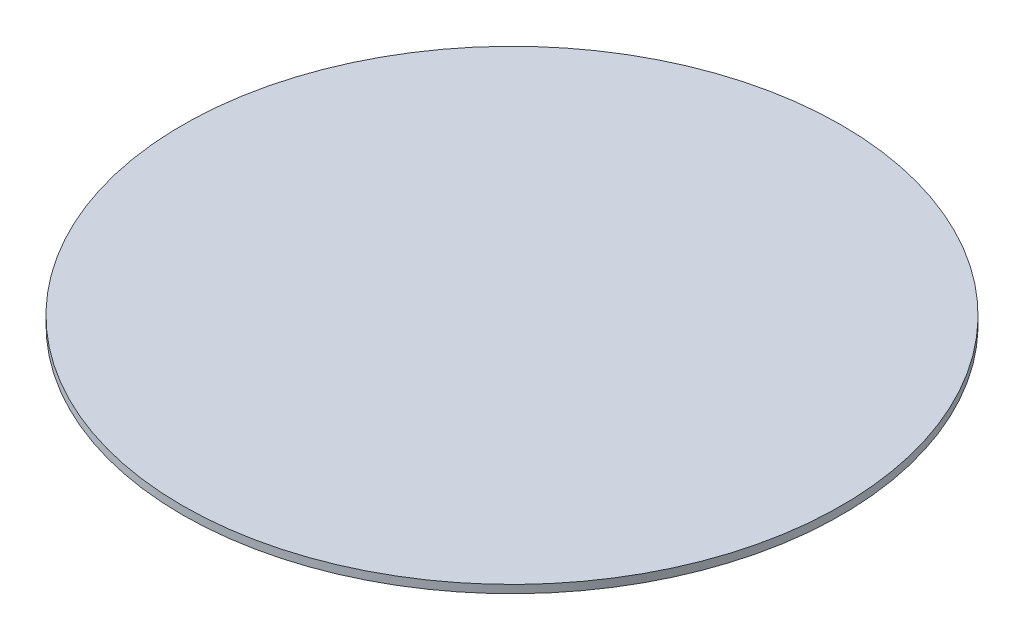
ISO-10303-21;
HEADER;
FILE_DESCRIPTION(('STEP AP214'),'2;1');
FILE_NAME('part.step','',(''),(''),'','','');
FILE_SCHEMA(('AUTOMOTIVE_DESIGN { 1 0 10303 214 1 1 1 1 }'));
ENDSEC;
DATA;
#1=APPLICATION_CONTEXT('core data for automotive mechanical design processes');
#2=APPLICATION_PROTOCOL_DEFINITION('international standard','automotive_design',2000,#1);
#3=PRODUCT_CONTEXT('',#1,'mechanical');
#4=PRODUCT('Part','Part','',(#3));
#5=PRODUCT_RELATED_PRODUCT_CATEGORY('part','',(#4));
#6=PRODUCT_DEFINITION_FORMATION('','',#4);
#7=PRODUCT_DEFINITION_CONTEXT('part definition',#1,'design');
#8=PRODUCT_DEFINITION('design','',#6,#7);
#9=PRODUCT_DEFINITION_SHAPE('','',#8);
#10=(LENGTH_UNIT() NAMED_UNIT(*) SI_UNIT(.MILLI.,.METRE.));
#11=(NAMED_UNIT(*) PLANE_ANGLE_UNIT() SI_UNIT($,.RADIAN.));
#12=(NAMED_UNIT(*) SI_UNIT($,.STERADIAN.) SOLID_ANGLE_UNIT());
#13=UNCERTAINTY_MEASURE_WITH_UNIT(LENGTH_MEASURE(1.E-05),#10,'distance_accuracy_value','');
#14=(GEOMETRIC_REPRESENTATION_CONTEXT(3) GLOBAL_UNCERTAINTY_ASSIGNED_CONTEXT((#13)) GLOBAL_UNIT_ASSIGNED_CONTEXT((#10,
#11,#12)) REPRESENTATION_CONTEXT('',''));
#15=CARTESIAN_POINT('',(0.,0.,0.));
#16=DIRECTION('',(0.,0.,1.));
#17=DIRECTION('',(1.,0.,0.));
#18=AXIS2_PLACEMENT_3D('',#15,#16,#17);
#19=CARTESIAN_POINT('',(0.,1.,0.));
#20=DIRECTION('',(0.,-1.,0.));
#21=DIRECTION('',(0.,0.,-1.));
#22=AXIS2_PLACEMENT_3D('',#19,#20,#21);
#23=CYLINDRICAL_SURFACE('',#22,41.);
#24=CARTESIAN_POINT('',(0.,1.,0.));
#25=DIRECTION('',(0.,1.,0.));
#26=DIRECTION('',(0.,0.,1.));
#27=AXIS2_PLACEMENT_3D('',#24,#25,#26);
#28=CIRCLE('',#27,41.);
#29=CARTESIAN_POINT('',(0.,1.,41.));
#30=VERTEX_POINT('',#29);
#31=EDGE_CURVE('E10',#30,#30,#28,.T.);
#32=ORIENTED_EDGE('',*,*,#31,.F.);
#33=EDGE_LOOP('',(#32));
#34=FACE_BOUND('',#33,.T.);
#35=CARTESIAN_POINT('',(0.,0.,0.));
#36=DIRECTION('',(0.,1.,0.));
#37=DIRECTION('',(0.,0.,1.));
#38=AXIS2_PLACEMENT_3D('',#35,#36,#37);
#39=CIRCLE('',#38,41.);
#40=CARTESIAN_POINT('',(0.,0.,41.));
#41=VERTEX_POINT('',#40);
#42=EDGE_CURVE('E34',#41,#41,#39,.T.);
#43=ORIENTED_EDGE('',*,*,#42,.T.);
#44=EDGE_LOOP('',(#43));
#45=FACE_BOUND('',#44,.T.);
#46=ADVANCED_FACE('F31',(#34,#45),#23,.T.);
#47=CARTESIAN_POINT('',(0.,1.,0.));
#48=DIRECTION('',(0.,1.,0.));
#49=DIRECTION('',(0.,0.,1.));
#50=AXIS2_PLACEMENT_3D('',#47,#48,#49);
#51=PLANE('',#50);
#52=ORIENTED_EDGE('',*,*,#31,.T.);
#53=EDGE_LOOP('',(#52));
#54=FACE_BOUND('',#53,.T.);
#55=ADVANCED_FACE('F46',(#54),#51,.T.);
#56=CARTESIAN_POINT('',(0.,0.,0.));
#57=DIRECTION('',(0.,1.,0.));
#58=DIRECTION('',(0.,0.,1.));
#59=AXIS2_PLACEMENT_3D('',#56,#57,#58);
#60=PLANE('',#59);
#61=ORIENTED_EDGE('',*,*,#42,.F.);
#62=EDGE_LOOP('',(#61));
#63=FACE_BOUND('',#62,.T.);
#64=ADVANCED_FACE('F44',(#63),#60,.F.);
#65=CLOSED_SHELL('',(#46,#55,#64));
#66=MANIFOLD_SOLID_BREP('B2',#65);
#67=ADVANCED_BREP_SHAPE_REPRESENTATION('',(#18,#66),#14);
#68=SHAPE_DEFINITION_REPRESENTATION(#9,#67);
ENDSEC;
END-ISO-10303-21;
